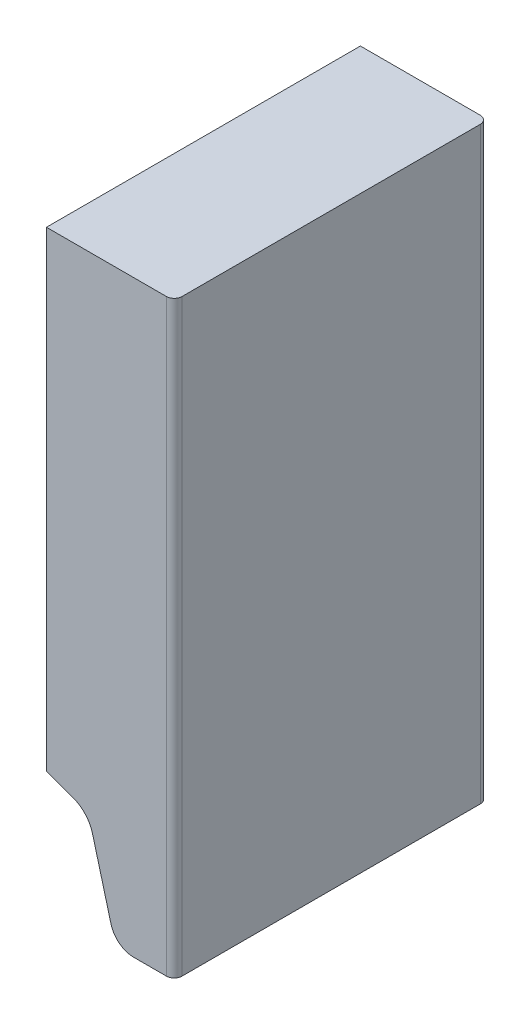
ISO-10303-21;
HEADER;
FILE_DESCRIPTION(('STEP AP214'),'2;1');
FILE_NAME('part.step','',(''),(''),'','','');
FILE_SCHEMA(('AUTOMOTIVE_DESIGN { 1 0 10303 214 1 1 1 1 }'));
ENDSEC;
DATA;
#1=APPLICATION_CONTEXT('core data for automotive mechanical design processes');
#2=APPLICATION_PROTOCOL_DEFINITION('international standard','automotive_design',2000,#1);
#3=PRODUCT_CONTEXT('',#1,'mechanical');
#4=PRODUCT('Part','Part','',(#3));
#5=PRODUCT_RELATED_PRODUCT_CATEGORY('part','',(#4));
#6=PRODUCT_DEFINITION_FORMATION('','',#4);
#7=PRODUCT_DEFINITION_CONTEXT('part definition',#1,'design');
#8=PRODUCT_DEFINITION('design','',#6,#7);
#9=PRODUCT_DEFINITION_SHAPE('','',#8);
#10=(LENGTH_UNIT() NAMED_UNIT(*) SI_UNIT(.MILLI.,.METRE.));
#11=(NAMED_UNIT(*) PLANE_ANGLE_UNIT() SI_UNIT($,.RADIAN.));
#12=(NAMED_UNIT(*) SI_UNIT($,.STERADIAN.) SOLID_ANGLE_UNIT());
#13=UNCERTAINTY_MEASURE_WITH_UNIT(LENGTH_MEASURE(1.E-05),#10,'distance_accuracy_value','');
#14=(GEOMETRIC_REPRESENTATION_CONTEXT(3) GLOBAL_UNCERTAINTY_ASSIGNED_CONTEXT((#13)) GLOBAL_UNIT_ASSIGNED_CONTEXT((#10,
#11,#12)) REPRESENTATION_CONTEXT('',''));
#15=CARTESIAN_POINT('',(0.,0.,0.));
#16=DIRECTION('',(0.,0.,1.));
#17=DIRECTION('',(1.,0.,0.));
#18=AXIS2_PLACEMENT_3D('',#15,#16,#17);
#19=CARTESIAN_POINT('',(8.14,-75.,20.));
#20=DIRECTION('',(1.,0.,0.));
#21=DIRECTION('',(0.,0.,-1.));
#22=AXIS2_PLACEMENT_3D('',#19,#20,#21);
#23=PLANE('',#22);
#24=DIRECTION('',(0.,0.,-1.));
#25=VECTOR('',#24,1.);
#26=CARTESIAN_POINT('',(8.14,-75.,20.));
#27=LINE('',#26,#25);
#28=CARTESIAN_POINT('',(8.14,-75.,19.));
#29=VERTEX_POINT('',#28);
#30=CARTESIAN_POINT('',(8.14,-75.,-19.));
#31=VERTEX_POINT('',#30);
#32=EDGE_CURVE('E176',#29,#31,#27,.T.);
#33=ORIENTED_EDGE('',*,*,#32,.T.);
#34=DIRECTION('',(0.,1.,0.));
#35=VECTOR('',#34,1.);
#36=CARTESIAN_POINT('',(8.14,-75.,-19.));
#37=LINE('',#36,#35);
#38=CARTESIAN_POINT('',(8.14,0.,-19.));
#39=VERTEX_POINT('',#38);
#40=EDGE_CURVE('E165',#31,#39,#37,.T.);
#41=ORIENTED_EDGE('',*,*,#40,.T.);
#42=DIRECTION('',(0.,0.,-1.));
#43=VECTOR('',#42,1.);
#44=CARTESIAN_POINT('',(8.14,0.,20.));
#45=LINE('',#44,#43);
#46=CARTESIAN_POINT('',(8.14,0.,19.));
#47=VERTEX_POINT('',#46);
#48=EDGE_CURVE('E130',#47,#39,#45,.T.);
#49=ORIENTED_EDGE('',*,*,#48,.F.);
#50=DIRECTION('',(0.,1.,0.));
#51=VECTOR('',#50,1.);
#52=CARTESIAN_POINT('',(8.14,-75.,19.));
#53=LINE('',#52,#51);
#54=EDGE_CURVE('E163',#47,#29,#53,.F.);
#55=ORIENTED_EDGE('',*,*,#54,.T.);
#56=EDGE_LOOP('',(#33,#41,#49,#55));
#57=FACE_BOUND('',#56,.T.);
#58=ADVANCED_FACE('F41',(#57),#23,.T.);
#59=CARTESIAN_POINT('',(-8.14,-75.,20.));
#60=DIRECTION('',(0.,0.,1.));
#61=DIRECTION('',(1.,0.,0.));
#62=AXIS2_PLACEMENT_3D('',#59,#60,#61);
#63=PLANE('',#62);
#64=DIRECTION('',(1.,0.,0.));
#65=VECTOR('',#64,1.);
#66=CARTESIAN_POINT('',(-8.14,-75.,20.));
#67=LINE('',#66,#65);
#68=CARTESIAN_POINT('',(2.98257760988845,-75.,20.));
#69=VERTEX_POINT('',#68);
#70=CARTESIAN_POINT('',(7.14,-75.,20.));
#71=VERTEX_POINT('',#70);
#72=EDGE_CURVE('E146',#69,#71,#67,.T.);
#73=ORIENTED_EDGE('',*,*,#72,.T.);
#74=DIRECTION('',(0.,1.,0.));
#75=VECTOR('',#74,1.);
#76=CARTESIAN_POINT('',(7.14,-75.,20.));
#77=LINE('',#76,#75);
#78=CARTESIAN_POINT('',(7.14,0.,20.));
#79=VERTEX_POINT('',#78);
#80=EDGE_CURVE('E11',#71,#79,#77,.T.);
#81=ORIENTED_EDGE('',*,*,#80,.T.);
#82=DIRECTION('',(1.,0.,0.));
#83=VECTOR('',#82,1.);
#84=CARTESIAN_POINT('',(-8.14,0.,20.));
#85=LINE('',#84,#83);
#86=CARTESIAN_POINT('',(-8.14,0.,20.));
#87=VERTEX_POINT('',#86);
#88=EDGE_CURVE('E183',#87,#79,#85,.T.);
#89=ORIENTED_EDGE('',*,*,#88,.F.);
#90=DIRECTION('',(0.,1.,0.));
#91=VECTOR('',#90,1.);
#92=CARTESIAN_POINT('',(-8.14,-75.,20.));
#93=LINE('',#92,#91);
#94=CARTESIAN_POINT('',(-8.14,-60.015348441564,20.));
#95=VERTEX_POINT('',#94);
#96=EDGE_CURVE('E145',#95,#87,#93,.T.);
#97=ORIENTED_EDGE('',*,*,#96,.F.);
#98=DIRECTION('',(-0.939692620785908,0.342020143325669,0.));
#99=VECTOR('',#98,1.);
#100=CARTESIAN_POINT('',(-4.77191942669732,-61.2412295168564,20.));
#101=LINE('',#100,#99);
#102=CARTESIAN_POINT('',(-4.77191942669732,-61.2412295168564,20.));
#103=VERTEX_POINT('',#102);
#104=EDGE_CURVE('E126',#103,#95,#101,.T.);
#105=ORIENTED_EDGE('',*,*,#104,.F.);
#106=CARTESIAN_POINT('',(-6.14,-65.,20.));
#107=DIRECTION('',(0.,0.,1.));
#108=DIRECTION('',(1.,0.,0.));
#109=AXIS2_PLACEMENT_3D('',#106,#107,#108);
#110=CIRCLE('',#109,4.);
#111=CARTESIAN_POINT('',(-2.27629669484373,-63.9647238195899,20.));
#112=VERTEX_POINT('',#111);
#113=EDGE_CURVE('E234',#112,#103,#110,.T.);
#114=ORIENTED_EDGE('',*,*,#113,.F.);
#115=DIRECTION('',(-0.258819045102522,0.965925826289068,0.));
#116=VECTOR('',#115,1.);
#117=CARTESIAN_POINT('',(-2.27629669484373,-63.9647238195899,20.));
#118=LINE('',#117,#116);
#119=CARTESIAN_POINT('',(0.0848001310212432,-72.7764571353076,20.));
#120=VERTEX_POINT('',#119);
#121=EDGE_CURVE('E140',#120,#112,#118,.T.);
#122=ORIENTED_EDGE('',*,*,#121,.F.);
#123=CARTESIAN_POINT('',(2.98257760988845,-72.,20.));
#124=DIRECTION('',(0.,0.,1.));
#125=DIRECTION('',(1.,0.,0.));
#126=AXIS2_PLACEMENT_3D('',#123,#124,#125);
#127=CIRCLE('',#126,3.);
#128=EDGE_CURVE('E156',#120,#69,#127,.T.);
#129=ORIENTED_EDGE('',*,*,#128,.T.);
#130=EDGE_LOOP('',(#73,#81,#89,#97,#105,#114,#122,#129));
#131=FACE_BOUND('',#130,.T.);
#132=ADVANCED_FACE('F195',(#131),#63,.T.);
#133=CARTESIAN_POINT('',(-8.14,-75.,20.));
#134=DIRECTION('',(-1.,0.,0.));
#135=DIRECTION('',(0.,0.,1.));
#136=AXIS2_PLACEMENT_3D('',#133,#134,#135);
#137=PLANE('',#136);
#138=DIRECTION('',(0.,0.,1.));
#139=VECTOR('',#138,1.);
#140=CARTESIAN_POINT('',(-8.14,-60.015348441564,-20.001));
#141=LINE('',#140,#139);
#142=CARTESIAN_POINT('',(-8.14,-60.015348441564,-20.));
#143=VERTEX_POINT('',#142);
#144=EDGE_CURVE('E120',#143,#95,#141,.T.);
#145=ORIENTED_EDGE('',*,*,#144,.T.);
#146=ORIENTED_EDGE('',*,*,#96,.T.);
#147=DIRECTION('',(0.,0.,1.));
#148=VECTOR('',#147,1.);
#149=CARTESIAN_POINT('',(-8.14,0.,20.));
#150=LINE('',#149,#148);
#151=CARTESIAN_POINT('',(-8.14,0.,-20.));
#152=VERTEX_POINT('',#151);
#153=EDGE_CURVE('E144',#152,#87,#150,.T.);
#154=ORIENTED_EDGE('',*,*,#153,.F.);
#155=DIRECTION('',(0.,1.,0.));
#156=VECTOR('',#155,1.);
#157=CARTESIAN_POINT('',(-8.14,-75.,-20.));
#158=LINE('',#157,#156);
#159=EDGE_CURVE('E136',#143,#152,#158,.T.);
#160=ORIENTED_EDGE('',*,*,#159,.F.);
#161=EDGE_LOOP('',(#145,#146,#154,#160));
#162=FACE_BOUND('',#161,.T.);
#163=ADVANCED_FACE('F142',(#162),#137,.T.);
#164=CARTESIAN_POINT('',(-8.14,-75.,-20.));
#165=DIRECTION('',(0.,0.,-1.));
#166=DIRECTION('',(-1.,0.,0.));
#167=AXIS2_PLACEMENT_3D('',#164,#165,#166);
#168=PLANE('',#167);
#169=DIRECTION('',(-1.,0.,0.));
#170=VECTOR('',#169,1.);
#171=CARTESIAN_POINT('',(-8.14,0.,-20.));
#172=LINE('',#171,#170);
#173=CARTESIAN_POINT('',(7.14,0.,-20.));
#174=VERTEX_POINT('',#173);
#175=EDGE_CURVE('E188',#174,#152,#172,.T.);
#176=ORIENTED_EDGE('',*,*,#175,.F.);
#177=DIRECTION('',(0.,1.,0.));
#178=VECTOR('',#177,1.);
#179=CARTESIAN_POINT('',(7.14,-75.,-20.));
#180=LINE('',#179,#178);
#181=CARTESIAN_POINT('',(7.14,-75.,-20.));
#182=VERTEX_POINT('',#181);
#183=EDGE_CURVE('E64',#174,#182,#180,.F.);
#184=ORIENTED_EDGE('',*,*,#183,.T.);
#185=DIRECTION('',(-1.,0.,0.));
#186=VECTOR('',#185,1.);
#187=CARTESIAN_POINT('',(-8.14,-75.,-20.));
#188=LINE('',#187,#186);
#189=CARTESIAN_POINT('',(2.98257760988845,-75.,-20.));
#190=VERTEX_POINT('',#189);
#191=EDGE_CURVE('E150',#182,#190,#188,.T.);
#192=ORIENTED_EDGE('',*,*,#191,.T.);
#193=CARTESIAN_POINT('',(2.98257760988845,-72.,-20.));
#194=DIRECTION('',(0.,0.,-1.));
#195=DIRECTION('',(-1.,0.,0.));
#196=AXIS2_PLACEMENT_3D('',#193,#194,#195);
#197=CIRCLE('',#196,3.);
#198=CARTESIAN_POINT('',(0.0848001310212432,-72.7764571353076,-20.));
#199=VERTEX_POINT('',#198);
#200=EDGE_CURVE('E161',#190,#199,#197,.T.);
#201=ORIENTED_EDGE('',*,*,#200,.T.);
#202=DIRECTION('',(-0.258819045102522,0.965925826289068,0.));
#203=VECTOR('',#202,1.);
#204=CARTESIAN_POINT('',(-2.27629669484373,-63.9647238195899,-20.));
#205=LINE('',#204,#203);
#206=CARTESIAN_POINT('',(-2.27629669484373,-63.9647238195899,-20.));
#207=VERTEX_POINT('',#206);
#208=EDGE_CURVE('E225',#199,#207,#205,.T.);
#209=ORIENTED_EDGE('',*,*,#208,.T.);
#210=CARTESIAN_POINT('',(-6.14,-65.,-20.));
#211=DIRECTION('',(0.,0.,-1.));
#212=DIRECTION('',(-1.,0.,0.));
#213=AXIS2_PLACEMENT_3D('',#210,#211,#212);
#214=CIRCLE('',#213,4.);
#215=CARTESIAN_POINT('',(-4.77191942669732,-61.2412295168564,-20.));
#216=VERTEX_POINT('',#215);
#217=EDGE_CURVE('E139',#207,#216,#214,.F.);
#218=ORIENTED_EDGE('',*,*,#217,.T.);
#219=DIRECTION('',(-0.939692620785908,0.342020143325669,0.));
#220=VECTOR('',#219,1.);
#221=CARTESIAN_POINT('',(-4.77191942669732,-61.2412295168564,-20.));
#222=LINE('',#221,#220);
#223=EDGE_CURVE('E123',#216,#143,#222,.T.);
#224=ORIENTED_EDGE('',*,*,#223,.T.);
#225=ORIENTED_EDGE('',*,*,#159,.T.);
#226=EDGE_LOOP('',(#176,#184,#192,#201,#209,#218,#224,#225));
#227=FACE_BOUND('',#226,.T.);
#228=ADVANCED_FACE('F135',(#227),#168,.T.);
#229=CARTESIAN_POINT('',(0.,-75.,0.));
#230=DIRECTION('',(0.,-1.,0.));
#231=DIRECTION('',(0.,0.,-1.));
#232=AXIS2_PLACEMENT_3D('',#229,#230,#231);
#233=PLANE('',#232);
#234=ORIENTED_EDGE('',*,*,#191,.F.);
#235=CARTESIAN_POINT('',(7.14,-75.,-19.));
#236=DIRECTION('',(0.,-1.,0.));
#237=DIRECTION('',(0.,0.,-1.));
#238=AXIS2_PLACEMENT_3D('',#235,#236,#237);
#239=CIRCLE('',#238,1.);
#240=EDGE_CURVE('E49',#182,#31,#239,.T.);
#241=ORIENTED_EDGE('',*,*,#240,.T.);
#242=ORIENTED_EDGE('',*,*,#32,.F.);
#243=CARTESIAN_POINT('',(7.14,-75.,19.));
#244=DIRECTION('',(0.,-1.,0.));
#245=DIRECTION('',(0.,0.,-1.));
#246=AXIS2_PLACEMENT_3D('',#243,#244,#245);
#247=CIRCLE('',#246,1.);
#248=EDGE_CURVE('E56',#29,#71,#247,.T.);
#249=ORIENTED_EDGE('',*,*,#248,.T.);
#250=ORIENTED_EDGE('',*,*,#72,.F.);
#251=DIRECTION('',(0.,0.,1.));
#252=VECTOR('',#251,1.);
#253=CARTESIAN_POINT('',(2.98257760988845,-75.,-20.));
#254=LINE('',#253,#252);
#255=EDGE_CURVE('E158',#69,#190,#254,.F.);
#256=ORIENTED_EDGE('',*,*,#255,.T.);
#257=EDGE_LOOP('',(#234,#241,#242,#249,#250,#256));
#258=FACE_BOUND('',#257,.T.);
#259=ADVANCED_FACE('F175',(#258),#233,.T.);
#260=CARTESIAN_POINT('',(0.,0.,0.));
#261=DIRECTION('',(0.,-1.,0.));
#262=DIRECTION('',(0.,0.,-1.));
#263=AXIS2_PLACEMENT_3D('',#260,#261,#262);
#264=PLANE('',#263);
#265=ORIENTED_EDGE('',*,*,#48,.T.);
#266=CARTESIAN_POINT('',(7.14,0.,-19.));
#267=DIRECTION('',(0.,-1.,0.));
#268=DIRECTION('',(0.,0.,-1.));
#269=AXIS2_PLACEMENT_3D('',#266,#267,#268);
#270=CIRCLE('',#269,1.);
#271=EDGE_CURVE('E170',#39,#174,#270,.F.);
#272=ORIENTED_EDGE('',*,*,#271,.T.);
#273=ORIENTED_EDGE('',*,*,#175,.T.);
#274=ORIENTED_EDGE('',*,*,#153,.T.);
#275=ORIENTED_EDGE('',*,*,#88,.T.);
#276=CARTESIAN_POINT('',(7.14,0.,19.));
#277=DIRECTION('',(0.,-1.,0.));
#278=DIRECTION('',(0.,0.,-1.));
#279=AXIS2_PLACEMENT_3D('',#276,#277,#278);
#280=CIRCLE('',#279,1.);
#281=EDGE_CURVE('E168',#79,#47,#280,.F.);
#282=ORIENTED_EDGE('',*,*,#281,.T.);
#283=EDGE_LOOP('',(#265,#272,#273,#274,#275,#282));
#284=FACE_BOUND('',#283,.T.);
#285=ADVANCED_FACE('F187',(#284),#264,.F.);
#286=CARTESIAN_POINT('',(-4.77191942669732,-61.2412295168564,-20.001));
#287=DIRECTION('',(0.342020143325669,0.939692620785908,0.));
#288=DIRECTION('',(-0.939692620785908,0.342020143325669,0.));
#289=AXIS2_PLACEMENT_3D('',#286,#287,#288);
#290=PLANE('',#289);
#291=DIRECTION('',(0.,0.,1.));
#292=VECTOR('',#291,1.);
#293=CARTESIAN_POINT('',(-4.77191942669732,-61.2412295168564,-20.001));
#294=LINE('',#293,#292);
#295=EDGE_CURVE('E131',#216,#103,#294,.T.);
#296=ORIENTED_EDGE('',*,*,#295,.T.);
#297=ORIENTED_EDGE('',*,*,#104,.T.);
#298=ORIENTED_EDGE('',*,*,#144,.F.);
#299=ORIENTED_EDGE('',*,*,#223,.F.);
#300=EDGE_LOOP('',(#296,#297,#298,#299));
#301=FACE_BOUND('',#300,.T.);
#302=ADVANCED_FACE('F122',(#301),#290,.F.);
#303=CARTESIAN_POINT('',(-6.14,-65.,-20.001));
#304=DIRECTION('',(0.,0.,1.));
#305=DIRECTION('',(1.,0.,0.));
#306=AXIS2_PLACEMENT_3D('',#303,#304,#305);
#307=CYLINDRICAL_SURFACE('',#306,4.);
#308=DIRECTION('',(0.,0.,1.));
#309=VECTOR('',#308,1.);
#310=CARTESIAN_POINT('',(-2.27629669484373,-63.9647238195899,-20.001));
#311=LINE('',#310,#309);
#312=EDGE_CURVE('E229',#207,#112,#311,.T.);
#313=ORIENTED_EDGE('',*,*,#312,.T.);
#314=ORIENTED_EDGE('',*,*,#113,.T.);
#315=ORIENTED_EDGE('',*,*,#295,.F.);
#316=ORIENTED_EDGE('',*,*,#217,.F.);
#317=EDGE_LOOP('',(#313,#314,#315,#316));
#318=FACE_BOUND('',#317,.T.);
#319=ADVANCED_FACE('F218',(#318),#307,.F.);
#320=CARTESIAN_POINT('',(-2.27629669484373,-63.9647238195899,-20.001));
#321=DIRECTION('',(0.965925826289068,0.258819045102522,0.));
#322=DIRECTION('',(-0.258819045102522,0.965925826289068,0.));
#323=AXIS2_PLACEMENT_3D('',#320,#321,#322);
#324=PLANE('',#323);
#325=ORIENTED_EDGE('',*,*,#208,.F.);
#326=DIRECTION('',(0.,0.,1.));
#327=VECTOR('',#326,1.);
#328=CARTESIAN_POINT('',(0.0848001310212428,-72.7764571353076,20.));
#329=LINE('',#328,#327);
#330=EDGE_CURVE('E148',#199,#120,#329,.T.);
#331=ORIENTED_EDGE('',*,*,#330,.T.);
#332=ORIENTED_EDGE('',*,*,#121,.T.);
#333=ORIENTED_EDGE('',*,*,#312,.F.);
#334=EDGE_LOOP('',(#325,#331,#332,#333));
#335=FACE_BOUND('',#334,.T.);
#336=ADVANCED_FACE('F213',(#335),#324,.F.);
#337=CARTESIAN_POINT('',(2.98257760988845,-72.,-20.001));
#338=DIRECTION('',(0.,0.,-1.));
#339=DIRECTION('',(-1.,0.,0.));
#340=AXIS2_PLACEMENT_3D('',#337,#338,#339);
#341=CYLINDRICAL_SURFACE('',#340,3.);
#342=ORIENTED_EDGE('',*,*,#200,.F.);
#343=ORIENTED_EDGE('',*,*,#255,.F.);
#344=ORIENTED_EDGE('',*,*,#128,.F.);
#345=ORIENTED_EDGE('',*,*,#330,.F.);
#346=EDGE_LOOP('',(#342,#343,#344,#345));
#347=FACE_BOUND('',#346,.T.);
#348=ADVANCED_FACE('F202',(#347),#341,.T.);
#349=CARTESIAN_POINT('',(7.14,-75.,-19.));
#350=DIRECTION('',(0.,1.,0.));
#351=DIRECTION('',(0.,0.,1.));
#352=AXIS2_PLACEMENT_3D('',#349,#350,#351);
#353=CYLINDRICAL_SURFACE('',#352,1.);
#354=ORIENTED_EDGE('',*,*,#240,.F.);
#355=ORIENTED_EDGE('',*,*,#183,.F.);
#356=ORIENTED_EDGE('',*,*,#271,.F.);
#357=ORIENTED_EDGE('',*,*,#40,.F.);
#358=EDGE_LOOP('',(#354,#355,#356,#357));
#359=FACE_BOUND('',#358,.T.);
#360=ADVANCED_FACE('F185',(#359),#353,.T.);
#361=CARTESIAN_POINT('',(7.14,-75.,19.));
#362=DIRECTION('',(0.,1.,0.));
#363=DIRECTION('',(0.,0.,1.));
#364=AXIS2_PLACEMENT_3D('',#361,#362,#363);
#365=CYLINDRICAL_SURFACE('',#364,1.);
#366=ORIENTED_EDGE('',*,*,#248,.F.);
#367=ORIENTED_EDGE('',*,*,#54,.F.);
#368=ORIENTED_EDGE('',*,*,#281,.F.);
#369=ORIENTED_EDGE('',*,*,#80,.F.);
#370=EDGE_LOOP('',(#366,#367,#368,#369));
#371=FACE_BOUND('',#370,.T.);
#372=ADVANCED_FACE('F43',(#371),#365,.T.);
#373=CLOSED_SHELL('',(#58,#132,#163,#228,#259,#285,#302,#319,#336,#348,#360,#372));
#374=MANIFOLD_SOLID_BREP('B2',#373);
#375=ADVANCED_BREP_SHAPE_REPRESENTATION('',(#18,#374),#14);
#376=SHAPE_DEFINITION_REPRESENTATION(#9,#375);
ENDSEC;
END-ISO-10303-21;
